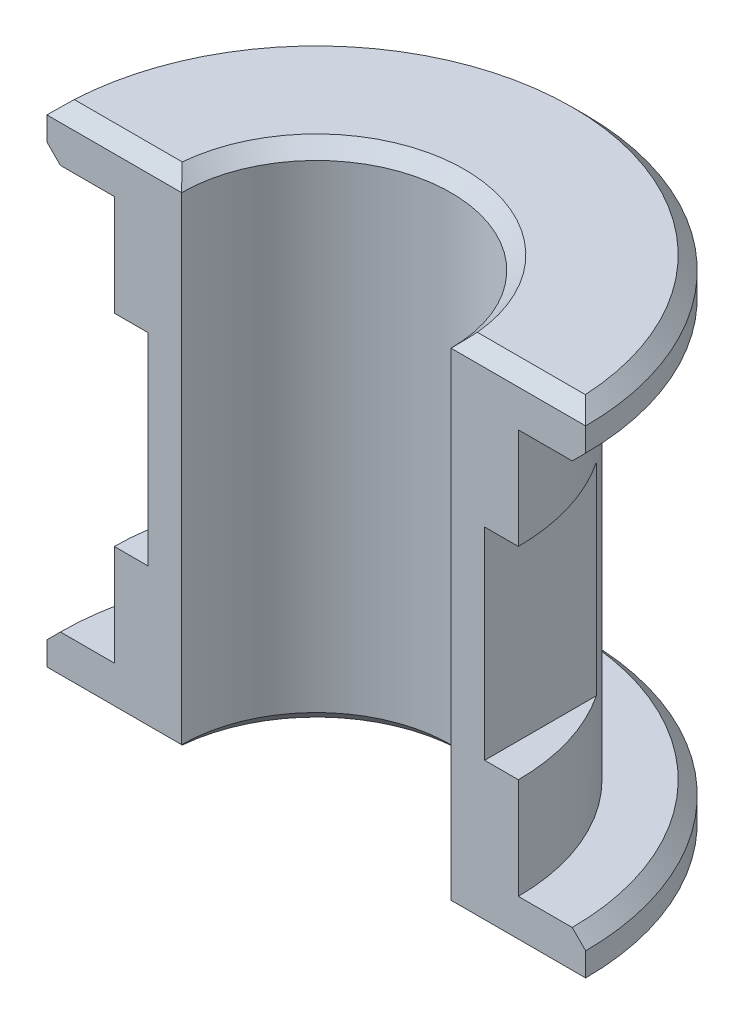
ISO-10303-21;
HEADER;
FILE_DESCRIPTION(('STEP AP214'),'2;1');
FILE_NAME('part.step','',(''),(''),'','','');
FILE_SCHEMA(('AUTOMOTIVE_DESIGN { 1 0 10303 214 1 1 1 1 }'));
ENDSEC;
DATA;
#1=APPLICATION_CONTEXT('core data for automotive mechanical design processes');
#2=APPLICATION_PROTOCOL_DEFINITION('international standard','automotive_design',2000,#1);
#3=PRODUCT_CONTEXT('',#1,'mechanical');
#4=PRODUCT('Part','Part','',(#3));
#5=PRODUCT_RELATED_PRODUCT_CATEGORY('part','',(#4));
#6=PRODUCT_DEFINITION_FORMATION('','',#4);
#7=PRODUCT_DEFINITION_CONTEXT('part definition',#1,'design');
#8=PRODUCT_DEFINITION('design','',#6,#7);
#9=PRODUCT_DEFINITION_SHAPE('','',#8);
#10=(LENGTH_UNIT() NAMED_UNIT(*) SI_UNIT(.MILLI.,.METRE.));
#11=(NAMED_UNIT(*) PLANE_ANGLE_UNIT() SI_UNIT($,.RADIAN.));
#12=(NAMED_UNIT(*) SI_UNIT($,.STERADIAN.) SOLID_ANGLE_UNIT());
#13=UNCERTAINTY_MEASURE_WITH_UNIT(LENGTH_MEASURE(1.E-05),#10,'distance_accuracy_value','');
#14=(GEOMETRIC_REPRESENTATION_CONTEXT(3) GLOBAL_UNCERTAINTY_ASSIGNED_CONTEXT((#13)) GLOBAL_UNIT_ASSIGNED_CONTEXT((#10,
#11,#12)) REPRESENTATION_CONTEXT('',''));
#15=CARTESIAN_POINT('',(0.,0.,0.));
#16=DIRECTION('',(0.,0.,1.));
#17=DIRECTION('',(1.,0.,0.));
#18=AXIS2_PLACEMENT_3D('',#15,#16,#17);
#19=CARTESIAN_POINT('',(0.,0.,0.));
#20=DIRECTION('',(0.,0.,-1.));
#21=DIRECTION('',(-1.,0.,0.));
#22=AXIS2_PLACEMENT_3D('',#19,#20,#21);
#23=PLANE('',#22);
#24=DIRECTION('',(0.,1.,0.));
#25=VECTOR('',#24,1.);
#26=CARTESIAN_POINT('',(-20.,37.5,1.39659253553725E-13));
#27=LINE('',#26,#25);
#28=CARTESIAN_POINT('',(-20.,-35.5,1.39659253553725E-13));
#29=VERTEX_POINT('',#28);
#30=CARTESIAN_POINT('',(-20.,35.5,1.39659253553725E-13));
#31=VERTEX_POINT('',#30);
#32=EDGE_CURVE('E465',#29,#31,#27,.T.);
#33=ORIENTED_EDGE('',*,*,#32,.T.);
#34=DIRECTION('',(-1.,0.,0.));
#35=VECTOR('',#34,1.);
#36=CARTESIAN_POINT('',(-40.,35.5,2.79318507107451E-13));
#37=LINE('',#36,#35);
#38=CARTESIAN_POINT('',(-40.,35.5,2.79318507107451E-13));
#39=VERTEX_POINT('',#38);
#40=EDGE_CURVE('E302',#31,#39,#37,.T.);
#41=ORIENTED_EDGE('',*,*,#40,.T.);
#42=DIRECTION('',(0.,1.,0.));
#43=VECTOR('',#42,1.);
#44=CARTESIAN_POINT('',(-40.,29.9999999905,2.79318507107451E-13));
#45=LINE('',#44,#43);
#46=CARTESIAN_POINT('',(-40.,31.9999999905,2.79318507107451E-13));
#47=VERTEX_POINT('',#46);
#48=EDGE_CURVE('E260',#47,#39,#45,.T.);
#49=ORIENTED_EDGE('',*,*,#48,.F.);
#50=DIRECTION('',(-0.707106781186546,0.707106781186549,0.));
#51=VECTOR('',#50,1.);
#52=CARTESIAN_POINT('',(0.,-8.00000000950015,0.));
#53=LINE('',#52,#51);
#54=CARTESIAN_POINT('',(-38.,29.9999999905,2.65352581752078E-13));
#55=VERTEX_POINT('',#54);
#56=EDGE_CURVE('E296',#47,#55,#53,.F.);
#57=ORIENTED_EDGE('',*,*,#56,.T.);
#58=DIRECTION('',(-1.,0.,0.));
#59=VECTOR('',#58,1.);
#60=CARTESIAN_POINT('',(-30.,29.9999999905,2.09488880330588E-13));
#61=LINE('',#60,#59);
#62=CARTESIAN_POINT('',(-30.,29.9999999905,2.09488880330588E-13));
#63=VERTEX_POINT('',#62);
#64=EDGE_CURVE('E257',#63,#55,#61,.T.);
#65=ORIENTED_EDGE('',*,*,#64,.F.);
#66=DIRECTION('',(0.,1.,0.));
#67=VECTOR('',#66,1.);
#68=CARTESIAN_POINT('',(-30.,-30.,2.09488880330588E-13));
#69=LINE('',#68,#67);
#70=CARTESIAN_POINT('',(-30.,15.,0.));
#71=VERTEX_POINT('',#70);
#72=EDGE_CURVE('E254',#71,#63,#69,.T.);
#73=ORIENTED_EDGE('',*,*,#72,.F.);
#74=DIRECTION('',(-1.,0.,0.));
#75=VECTOR('',#74,1.);
#76=CARTESIAN_POINT('',(-24.9999999986886,15.,0.));
#77=LINE('',#76,#75);
#78=CARTESIAN_POINT('',(-24.9999999986886,15.,0.));
#79=VERTEX_POINT('',#78);
#80=EDGE_CURVE('E194',#79,#71,#77,.T.);
#81=ORIENTED_EDGE('',*,*,#80,.F.);
#82=DIRECTION('',(0.,-1.,0.));
#83=VECTOR('',#82,1.);
#84=CARTESIAN_POINT('',(-24.9999999986886,15.,0.));
#85=LINE('',#84,#83);
#86=CARTESIAN_POINT('',(-24.9999999986886,-15.,0.));
#87=VERTEX_POINT('',#86);
#88=EDGE_CURVE('E191',#79,#87,#85,.T.);
#89=ORIENTED_EDGE('',*,*,#88,.T.);
#90=DIRECTION('',(-1.,0.,0.));
#91=VECTOR('',#90,1.);
#92=CARTESIAN_POINT('',(-24.9999999986886,-15.,0.));
#93=LINE('',#92,#91);
#94=CARTESIAN_POINT('',(-30.,-15.,2.09488880330588E-13));
#95=VERTEX_POINT('',#94);
#96=EDGE_CURVE('E201',#87,#95,#93,.T.);
#97=ORIENTED_EDGE('',*,*,#96,.T.);
#98=CARTESIAN_POINT('',(-30.,-30.,2.09488880330588E-13));
#99=VERTEX_POINT('',#98);
#100=EDGE_CURVE('E255',#99,#95,#69,.T.);
#101=ORIENTED_EDGE('',*,*,#100,.F.);
#102=DIRECTION('',(1.,0.,0.));
#103=VECTOR('',#102,1.);
#104=CARTESIAN_POINT('',(-40.,-30.,2.79318507107451E-13));
#105=LINE('',#104,#103);
#106=CARTESIAN_POINT('',(-38.,-30.,2.65352581752078E-13));
#107=VERTEX_POINT('',#106);
#108=EDGE_CURVE('E252',#107,#99,#105,.T.);
#109=ORIENTED_EDGE('',*,*,#108,.F.);
#110=DIRECTION('',(0.707106781186548,0.707106781186547,0.));
#111=VECTOR('',#110,1.);
#112=CARTESIAN_POINT('',(0.,8.00000000000001,0.));
#113=LINE('',#112,#111);
#114=CARTESIAN_POINT('',(-40.,-32.,2.79318507107451E-13));
#115=VERTEX_POINT('',#114);
#116=EDGE_CURVE('E298',#107,#115,#113,.F.);
#117=ORIENTED_EDGE('',*,*,#116,.T.);
#118=DIRECTION('',(0.,1.,0.));
#119=VECTOR('',#118,1.);
#120=CARTESIAN_POINT('',(-40.,-37.5,2.79318507107451E-13));
#121=LINE('',#120,#119);
#122=CARTESIAN_POINT('',(-40.,-35.5,2.79318507107451E-13));
#123=VERTEX_POINT('',#122);
#124=EDGE_CURVE('E249',#123,#115,#121,.T.);
#125=ORIENTED_EDGE('',*,*,#124,.F.);
#126=DIRECTION('',(1.,0.,0.));
#127=VECTOR('',#126,1.);
#128=CARTESIAN_POINT('',(-20.,-35.5,1.39659253553725E-13));
#129=LINE('',#128,#127);
#130=EDGE_CURVE('E300',#123,#29,#129,.T.);
#131=ORIENTED_EDGE('',*,*,#130,.T.);
#132=EDGE_LOOP('',(#33,#41,#49,#57,#65,#73,#81,#89,#97,#101,#109,#117,#125,#131));
#133=FACE_BOUND('',#132,.T.);
#134=ADVANCED_FACE('F37',(#133),#23,.F.);
#135=CARTESIAN_POINT('',(0.,37.5,0.));
#136=DIRECTION('',(0.,-1.,0.));
#137=DIRECTION('',(0.,0.,-1.));
#138=AXIS2_PLACEMENT_3D('',#135,#136,#137);
#139=CYLINDRICAL_SURFACE('',#138,30.);
#140=DIRECTION('',(0.,-1.,0.));
#141=VECTOR('',#140,1.);
#142=CARTESIAN_POINT('',(-24.9999999986886,15.,-16.583123953754));
#143=LINE('',#142,#141);
#144=CARTESIAN_POINT('',(-24.9999999986886,15.,-16.583123953754));
#145=VERTEX_POINT('',#144);
#146=CARTESIAN_POINT('',(-24.9999999986886,-15.,-16.583123953754));
#147=VERTEX_POINT('',#146);
#148=EDGE_CURVE('E188',#145,#147,#143,.T.);
#149=ORIENTED_EDGE('',*,*,#148,.F.);
#150=CARTESIAN_POINT('',(0.,15.,0.));
#151=DIRECTION('',(0.,-1.,0.));
#152=DIRECTION('',(0.,0.,-1.));
#153=AXIS2_PLACEMENT_3D('',#150,#151,#152);
#154=CIRCLE('',#153,30.);
#155=EDGE_CURVE('E195',#71,#145,#154,.T.);
#156=ORIENTED_EDGE('',*,*,#155,.F.);
#157=ORIENTED_EDGE('',*,*,#72,.T.);
#158=CARTESIAN_POINT('',(0.,29.9999999905,0.));
#159=DIRECTION('',(0.,-1.,0.));
#160=DIRECTION('',(0.,0.,-1.));
#161=AXIS2_PLACEMENT_3D('',#158,#159,#160);
#162=CIRCLE('',#161,30.);
#163=CARTESIAN_POINT('',(30.,29.9999999905,0.));
#164=VERTEX_POINT('',#163);
#165=EDGE_CURVE('E263',#63,#164,#162,.T.);
#166=ORIENTED_EDGE('',*,*,#165,.T.);
#167=DIRECTION('',(0.,1.,0.));
#168=VECTOR('',#167,1.);
#169=CARTESIAN_POINT('',(30.,-30.,0.));
#170=LINE('',#169,#168);
#171=CARTESIAN_POINT('',(30.0000000028004,15.,0.));
#172=VERTEX_POINT('',#171);
#173=EDGE_CURVE('E239',#172,#164,#170,.T.);
#174=ORIENTED_EDGE('',*,*,#173,.F.);
#175=CARTESIAN_POINT('',(2.8004363944171E-09,15.,0.));
#176=DIRECTION('',(0.,-1.,0.));
#177=DIRECTION('',(0.,0.,-1.));
#178=AXIS2_PLACEMENT_3D('',#175,#176,#177);
#179=CIRCLE('',#178,30.);
#180=CARTESIAN_POINT('',(25.,15.,-16.5831239559988));
#181=VERTEX_POINT('',#180);
#182=EDGE_CURVE('E220',#181,#172,#179,.T.);
#183=ORIENTED_EDGE('',*,*,#182,.F.);
#184=DIRECTION('',(0.,-1.,0.));
#185=VECTOR('',#184,1.);
#186=CARTESIAN_POINT('',(25.,15.,-16.5831239559988));
#187=LINE('',#186,#185);
#188=CARTESIAN_POINT('',(25.,-15.,-16.5831239559988));
#189=VERTEX_POINT('',#188);
#190=EDGE_CURVE('E229',#181,#189,#187,.T.);
#191=ORIENTED_EDGE('',*,*,#190,.T.);
#192=CARTESIAN_POINT('',(2.8004363944171E-09,-15.,0.));
#193=DIRECTION('',(0.,-1.,0.));
#194=DIRECTION('',(0.,0.,-1.));
#195=AXIS2_PLACEMENT_3D('',#192,#193,#194);
#196=CIRCLE('',#195,30.);
#197=CARTESIAN_POINT('',(30.0000000028004,-15.,0.));
#198=VERTEX_POINT('',#197);
#199=EDGE_CURVE('E217',#189,#198,#196,.T.);
#200=ORIENTED_EDGE('',*,*,#199,.T.);
#201=CARTESIAN_POINT('',(30.,-30.,0.));
#202=VERTEX_POINT('',#201);
#203=EDGE_CURVE('E240',#202,#198,#170,.T.);
#204=ORIENTED_EDGE('',*,*,#203,.F.);
#205=CARTESIAN_POINT('',(0.,-30.,0.));
#206=DIRECTION('',(0.,-1.,0.));
#207=DIRECTION('',(0.,0.,-1.));
#208=AXIS2_PLACEMENT_3D('',#205,#206,#207);
#209=CIRCLE('',#208,30.);
#210=EDGE_CURVE('E266',#99,#202,#209,.T.);
#211=ORIENTED_EDGE('',*,*,#210,.F.);
#212=ORIENTED_EDGE('',*,*,#100,.T.);
#213=CARTESIAN_POINT('',(0.,-15.,0.));
#214=DIRECTION('',(0.,-1.,0.));
#215=DIRECTION('',(0.,0.,-1.));
#216=AXIS2_PLACEMENT_3D('',#213,#214,#215);
#217=CIRCLE('',#216,30.);
#218=EDGE_CURVE('E206',#95,#147,#217,.T.);
#219=ORIENTED_EDGE('',*,*,#218,.T.);
#220=EDGE_LOOP('',(#149,#156,#157,#166,#174,#183,#191,#200,#204,#211,#212,#219));
#221=FACE_BOUND('',#220,.T.);
#222=ADVANCED_FACE('F204',(#221),#139,.T.);
#223=DIRECTION('',(0.,1.,0.));
#224=VECTOR('',#223,1.);
#225=CARTESIAN_POINT('',(40.,29.9999999905,0.));
#226=LINE('',#225,#224);
#227=CARTESIAN_POINT('',(40.,31.9999999905,0.));
#228=VERTEX_POINT('',#227);
#229=CARTESIAN_POINT('',(40.,35.5,0.));
#230=VERTEX_POINT('',#229);
#231=EDGE_CURVE('E246',#228,#230,#226,.T.);
#232=ORIENTED_EDGE('',*,*,#231,.T.);
#233=DIRECTION('',(-1.,0.,0.));
#234=VECTOR('',#233,1.);
#235=CARTESIAN_POINT('',(20.,35.5,-1.39659253553725E-13));
#236=LINE('',#235,#234);
#237=CARTESIAN_POINT('',(20.,35.5,-1.39659253553725E-13));
#238=VERTEX_POINT('',#237);
#239=EDGE_CURVE('E285',#230,#238,#236,.T.);
#240=ORIENTED_EDGE('',*,*,#239,.T.);
#241=DIRECTION('',(0.,1.,0.));
#242=VECTOR('',#241,1.);
#243=CARTESIAN_POINT('',(20.,37.5,-1.39659253553725E-13));
#244=LINE('',#243,#242);
#245=CARTESIAN_POINT('',(20.,-35.5,-1.39659253553725E-13));
#246=VERTEX_POINT('',#245);
#247=EDGE_CURVE('E358',#238,#246,#244,.F.);
#248=ORIENTED_EDGE('',*,*,#247,.T.);
#249=DIRECTION('',(1.,0.,0.));
#250=VECTOR('',#249,1.);
#251=CARTESIAN_POINT('',(40.,-35.5,-2.79318507107451E-13));
#252=LINE('',#251,#250);
#253=CARTESIAN_POINT('',(40.,-35.5,0.));
#254=VERTEX_POINT('',#253);
#255=EDGE_CURVE('E282',#246,#254,#252,.T.);
#256=ORIENTED_EDGE('',*,*,#255,.T.);
#257=DIRECTION('',(0.,1.,0.));
#258=VECTOR('',#257,1.);
#259=CARTESIAN_POINT('',(40.,-37.5,0.));
#260=LINE('',#259,#258);
#261=CARTESIAN_POINT('',(40.,-32.,-1.39659253553725E-13));
#262=VERTEX_POINT('',#261);
#263=EDGE_CURVE('E232',#254,#262,#260,.T.);
#264=ORIENTED_EDGE('',*,*,#263,.T.);
#265=DIRECTION('',(0.707106781186548,-0.707106781186547,0.));
#266=VECTOR('',#265,1.);
#267=CARTESIAN_POINT('',(0.,8.00000000000001,0.));
#268=LINE('',#267,#266);
#269=CARTESIAN_POINT('',(38.,-30.,0.));
#270=VERTEX_POINT('',#269);
#271=EDGE_CURVE('E280',#262,#270,#268,.F.);
#272=ORIENTED_EDGE('',*,*,#271,.T.);
#273=DIRECTION('',(-1.,0.,0.));
#274=VECTOR('',#273,1.);
#275=CARTESIAN_POINT('',(40.,-30.,0.));
#276=LINE('',#275,#274);
#277=EDGE_CURVE('E237',#270,#202,#276,.T.);
#278=ORIENTED_EDGE('',*,*,#277,.T.);
#279=ORIENTED_EDGE('',*,*,#203,.T.);
#280=DIRECTION('',(-1.,0.,0.));
#281=VECTOR('',#280,1.);
#282=CARTESIAN_POINT('',(30.0000000028004,-15.,0.));
#283=LINE('',#282,#281);
#284=CARTESIAN_POINT('',(25.,-15.,-1.74574066942157E-13));
#285=VERTEX_POINT('',#284);
#286=EDGE_CURVE('E208',#198,#285,#283,.T.);
#287=ORIENTED_EDGE('',*,*,#286,.T.);
#288=DIRECTION('',(0.,-1.,0.));
#289=VECTOR('',#288,1.);
#290=CARTESIAN_POINT('',(25.,15.,0.));
#291=LINE('',#290,#289);
#292=CARTESIAN_POINT('',(25.,15.,0.));
#293=VERTEX_POINT('',#292);
#294=EDGE_CURVE('E222',#293,#285,#291,.T.);
#295=ORIENTED_EDGE('',*,*,#294,.F.);
#296=DIRECTION('',(-1.,0.,0.));
#297=VECTOR('',#296,1.);
#298=CARTESIAN_POINT('',(30.0000000028004,15.,0.));
#299=LINE('',#298,#297);
#300=EDGE_CURVE('E213',#172,#293,#299,.T.);
#301=ORIENTED_EDGE('',*,*,#300,.F.);
#302=ORIENTED_EDGE('',*,*,#173,.T.);
#303=DIRECTION('',(1.,0.,0.));
#304=VECTOR('',#303,1.);
#305=CARTESIAN_POINT('',(30.,29.9999999905,0.));
#306=LINE('',#305,#304);
#307=CARTESIAN_POINT('',(38.,29.9999999905,-1.32676290876039E-13));
#308=VERTEX_POINT('',#307);
#309=EDGE_CURVE('E243',#164,#308,#306,.T.);
#310=ORIENTED_EDGE('',*,*,#309,.T.);
#311=DIRECTION('',(-0.707106781186546,-0.707106781186549,0.));
#312=VECTOR('',#311,1.);
#313=CARTESIAN_POINT('',(0.,-8.00000000950015,0.));
#314=LINE('',#313,#312);
#315=EDGE_CURVE('E278',#308,#228,#314,.F.);
#316=ORIENTED_EDGE('',*,*,#315,.T.);
#317=EDGE_LOOP('',(#232,#240,#248,#256,#264,#272,#278,#279,#287,#295,#301,#302,#310,#316));
#318=FACE_BOUND('',#317,.T.);
#319=ADVANCED_FACE('F408',(#318),#23,.F.);
#320=CARTESIAN_POINT('',(-40.,37.5,2.79318507107451E-13));
#321=DIRECTION('',(0.,1.,0.));
#322=DIRECTION('',(0.,0.,1.));
#323=AXIS2_PLACEMENT_3D('',#320,#321,#322);
#324=PLANE('',#323);
#325=CARTESIAN_POINT('',(0.,37.5,0.));
#326=DIRECTION('',(0.,1.,0.));
#327=DIRECTION('',(0.,0.,1.));
#328=AXIS2_PLACEMENT_3D('',#325,#326,#327);
#329=CIRCLE('',#328,21.9999999999999);
#330=CARTESIAN_POINT('',(-21.9089023002066,37.5,-1.99999999999981));
#331=VERTEX_POINT('',#330);
#332=CARTESIAN_POINT('',(21.9089023002066,37.5,-2.00000000000011));
#333=VERTEX_POINT('',#332);
#334=EDGE_CURVE('E273',#331,#333,#329,.F.);
#335=ORIENTED_EDGE('',*,*,#334,.T.);
#336=DIRECTION('',(1.,0.,0.));
#337=VECTOR('',#336,1.);
#338=CARTESIAN_POINT('',(40.,37.5,-2.00000000000024));
#339=LINE('',#338,#337);
#340=CARTESIAN_POINT('',(37.9473319220206,37.5,-2.00000000000023));
#341=VERTEX_POINT('',#340);
#342=EDGE_CURVE('E275',#333,#341,#339,.T.);
#343=ORIENTED_EDGE('',*,*,#342,.T.);
#344=CARTESIAN_POINT('',(0.,37.5,0.));
#345=DIRECTION('',(0.,1.,0.));
#346=DIRECTION('',(0.,0.,1.));
#347=AXIS2_PLACEMENT_3D('',#344,#345,#346);
#348=CIRCLE('',#347,38.);
#349=CARTESIAN_POINT('',(-37.9473319220206,37.5,-1.9999999999997));
#350=VERTEX_POINT('',#349);
#351=EDGE_CURVE('E271',#341,#350,#348,.T.);
#352=ORIENTED_EDGE('',*,*,#351,.T.);
#353=DIRECTION('',(1.,0.,0.));
#354=VECTOR('',#353,1.);
#355=CARTESIAN_POINT('',(-20.,37.5,-1.99999999999982));
#356=LINE('',#355,#354);
#357=EDGE_CURVE('E269',#350,#331,#356,.T.);
#358=ORIENTED_EDGE('',*,*,#357,.T.);
#359=EDGE_LOOP('',(#335,#343,#352,#358));
#360=FACE_BOUND('',#359,.T.);
#361=ADVANCED_FACE('F493',(#360),#324,.T.);
#362=CARTESIAN_POINT('',(0.,-37.5,0.));
#363=DIRECTION('',(0.,-1.,0.));
#364=DIRECTION('',(0.,0.,-1.));
#365=AXIS2_PLACEMENT_3D('',#362,#363,#364);
#366=PLANE('',#365);
#367=CARTESIAN_POINT('',(0.,-37.5,0.));
#368=DIRECTION('',(0.,-1.,0.));
#369=DIRECTION('',(0.,0.,-1.));
#370=AXIS2_PLACEMENT_3D('',#367,#368,#369);
#371=CIRCLE('',#370,38.);
#372=CARTESIAN_POINT('',(-37.9473319220206,-37.5,-1.9999999999997));
#373=VERTEX_POINT('',#372);
#374=CARTESIAN_POINT('',(37.9473319220206,-37.5,-2.00000000000023));
#375=VERTEX_POINT('',#374);
#376=EDGE_CURVE('E68',#373,#375,#371,.T.);
#377=ORIENTED_EDGE('',*,*,#376,.T.);
#378=DIRECTION('',(-1.,0.,0.));
#379=VECTOR('',#378,1.);
#380=CARTESIAN_POINT('',(20.,-37.5,-2.0000000000001));
#381=LINE('',#380,#379);
#382=CARTESIAN_POINT('',(21.9089023002066,-37.5,-2.00000000000011));
#383=VERTEX_POINT('',#382);
#384=EDGE_CURVE('E309',#375,#383,#381,.T.);
#385=ORIENTED_EDGE('',*,*,#384,.T.);
#386=CARTESIAN_POINT('',(0.,-37.5,0.));
#387=DIRECTION('',(0.,-1.,0.));
#388=DIRECTION('',(0.,0.,-1.));
#389=AXIS2_PLACEMENT_3D('',#386,#387,#388);
#390=CIRCLE('',#389,21.9999999999999);
#391=CARTESIAN_POINT('',(-21.9089023002066,-37.5,-1.99999999999981));
#392=VERTEX_POINT('',#391);
#393=EDGE_CURVE('E307',#383,#392,#390,.F.);
#394=ORIENTED_EDGE('',*,*,#393,.T.);
#395=DIRECTION('',(-1.,0.,0.));
#396=VECTOR('',#395,1.);
#397=CARTESIAN_POINT('',(-40.,-37.5,-1.99999999999968));
#398=LINE('',#397,#396);
#399=EDGE_CURVE('E304',#392,#373,#398,.T.);
#400=ORIENTED_EDGE('',*,*,#399,.T.);
#401=EDGE_LOOP('',(#377,#385,#394,#400));
#402=FACE_BOUND('',#401,.T.);
#403=ADVANCED_FACE('F497',(#402),#366,.T.);
#404=CARTESIAN_POINT('',(0.,37.5,0.));
#405=DIRECTION('',(0.,-1.,0.));
#406=DIRECTION('',(0.,0.,-1.));
#407=AXIS2_PLACEMENT_3D('',#404,#405,#406);
#408=CYLINDRICAL_SURFACE('',#407,40.);
#409=ORIENTED_EDGE('',*,*,#263,.F.);
#410=CARTESIAN_POINT('',(0.,-35.5,0.));
#411=DIRECTION('',(0.,-1.,0.));
#412=DIRECTION('',(0.,0.,-1.));
#413=AXIS2_PLACEMENT_3D('',#410,#411,#412);
#414=CIRCLE('',#413,40.);
#415=EDGE_CURVE('E314',#254,#123,#414,.F.);
#416=ORIENTED_EDGE('',*,*,#415,.T.);
#417=ORIENTED_EDGE('',*,*,#124,.T.);
#418=CARTESIAN_POINT('',(0.,-32.,0.));
#419=DIRECTION('',(0.,1.,0.));
#420=DIRECTION('',(0.,0.,1.));
#421=AXIS2_PLACEMENT_3D('',#418,#419,#420);
#422=CIRCLE('',#421,40.);
#423=EDGE_CURVE('E311',#115,#262,#422,.F.);
#424=ORIENTED_EDGE('',*,*,#423,.T.);
#425=EDGE_LOOP('',(#409,#416,#417,#424));
#426=FACE_BOUND('',#425,.T.);
#427=ADVANCED_FACE('F410',(#426),#408,.T.);
#428=CARTESIAN_POINT('',(-40.,-30.,2.79318507107451E-13));
#429=DIRECTION('',(0.,1.,0.));
#430=DIRECTION('',(0.,0.,1.));
#431=AXIS2_PLACEMENT_3D('',#428,#429,#430);
#432=PLANE('',#431);
#433=ORIENTED_EDGE('',*,*,#277,.F.);
#434=CARTESIAN_POINT('',(0.,-30.,0.));
#435=DIRECTION('',(0.,1.,0.));
#436=DIRECTION('',(0.,0.,1.));
#437=AXIS2_PLACEMENT_3D('',#434,#435,#436);
#438=CIRCLE('',#437,38.);
#439=EDGE_CURVE('E52',#270,#107,#438,.T.);
#440=ORIENTED_EDGE('',*,*,#439,.T.);
#441=ORIENTED_EDGE('',*,*,#108,.T.);
#442=ORIENTED_EDGE('',*,*,#210,.T.);
#443=EDGE_LOOP('',(#433,#440,#441,#442));
#444=FACE_BOUND('',#443,.T.);
#445=ADVANCED_FACE('F417',(#444),#432,.T.);
#446=CARTESIAN_POINT('',(-30.,29.9999999905,2.09488880330588E-13));
#447=DIRECTION('',(0.,-1.,0.));
#448=DIRECTION('',(0.,0.,-1.));
#449=AXIS2_PLACEMENT_3D('',#446,#447,#448);
#450=PLANE('',#449);
#451=ORIENTED_EDGE('',*,*,#64,.T.);
#452=CARTESIAN_POINT('',(0.,29.9999999905,0.));
#453=DIRECTION('',(0.,-1.,0.));
#454=DIRECTION('',(0.,0.,-1.));
#455=AXIS2_PLACEMENT_3D('',#452,#453,#454);
#456=CIRCLE('',#455,38.);
#457=EDGE_CURVE('E11',#55,#308,#456,.T.);
#458=ORIENTED_EDGE('',*,*,#457,.T.);
#459=ORIENTED_EDGE('',*,*,#309,.F.);
#460=ORIENTED_EDGE('',*,*,#165,.F.);
#461=EDGE_LOOP('',(#451,#458,#459,#460));
#462=FACE_BOUND('',#461,.T.);
#463=ADVANCED_FACE('F437',(#462),#450,.T.);
#464=CARTESIAN_POINT('',(0.,37.5,0.));
#465=DIRECTION('',(0.,-1.,0.));
#466=DIRECTION('',(0.,0.,-1.));
#467=AXIS2_PLACEMENT_3D('',#464,#465,#466);
#468=CYLINDRICAL_SURFACE('',#467,40.);
#469=ORIENTED_EDGE('',*,*,#48,.T.);
#470=CARTESIAN_POINT('',(0.,35.5,0.));
#471=DIRECTION('',(0.,1.,0.));
#472=DIRECTION('',(0.,0.,1.));
#473=AXIS2_PLACEMENT_3D('',#470,#471,#472);
#474=CIRCLE('',#473,40.);
#475=EDGE_CURVE('E294',#39,#230,#474,.F.);
#476=ORIENTED_EDGE('',*,*,#475,.T.);
#477=ORIENTED_EDGE('',*,*,#231,.F.);
#478=CARTESIAN_POINT('',(0.,31.9999999905,0.));
#479=DIRECTION('',(0.,-1.,0.));
#480=DIRECTION('',(0.,0.,-1.));
#481=AXIS2_PLACEMENT_3D('',#478,#479,#480);
#482=CIRCLE('',#481,40.);
#483=EDGE_CURVE('E292',#228,#47,#482,.F.);
#484=ORIENTED_EDGE('',*,*,#483,.T.);
#485=EDGE_LOOP('',(#469,#476,#477,#484));
#486=FACE_BOUND('',#485,.T.);
#487=ADVANCED_FACE('F444',(#486),#468,.T.);
#488=CARTESIAN_POINT('',(25.,15.,0.));
#489=DIRECTION('',(-1.,0.,0.));
#490=DIRECTION('',(0.,0.,1.));
#491=AXIS2_PLACEMENT_3D('',#488,#489,#490);
#492=PLANE('',#491);
#493=DIRECTION('',(0.,0.,-1.));
#494=VECTOR('',#493,1.);
#495=CARTESIAN_POINT('',(25.,-15.,0.));
#496=LINE('',#495,#494);
#497=EDGE_CURVE('E225',#285,#189,#496,.T.);
#498=ORIENTED_EDGE('',*,*,#497,.T.);
#499=ORIENTED_EDGE('',*,*,#190,.F.);
#500=DIRECTION('',(0.,0.,-1.));
#501=VECTOR('',#500,1.);
#502=CARTESIAN_POINT('',(25.,15.,0.));
#503=LINE('',#502,#501);
#504=EDGE_CURVE('E216',#293,#181,#503,.T.);
#505=ORIENTED_EDGE('',*,*,#504,.F.);
#506=ORIENTED_EDGE('',*,*,#294,.T.);
#507=EDGE_LOOP('',(#498,#499,#505,#506));
#508=FACE_BOUND('',#507,.T.);
#509=ADVANCED_FACE('F428',(#508),#492,.F.);
#510=CARTESIAN_POINT('',(2.8004363944171E-09,15.,0.));
#511=DIRECTION('',(0.,-1.,0.));
#512=DIRECTION('',(0.,0.,-1.));
#513=AXIS2_PLACEMENT_3D('',#510,#511,#512);
#514=PLANE('',#513);
#515=ORIENTED_EDGE('',*,*,#300,.T.);
#516=ORIENTED_EDGE('',*,*,#504,.T.);
#517=ORIENTED_EDGE('',*,*,#182,.T.);
#518=EDGE_LOOP('',(#515,#516,#517));
#519=FACE_BOUND('',#518,.T.);
#520=ADVANCED_FACE('F431',(#519),#514,.T.);
#521=CARTESIAN_POINT('',(2.8004363944171E-09,-15.,0.));
#522=DIRECTION('',(0.,-1.,0.));
#523=DIRECTION('',(0.,0.,-1.));
#524=AXIS2_PLACEMENT_3D('',#521,#522,#523);
#525=PLANE('',#524);
#526=ORIENTED_EDGE('',*,*,#286,.F.);
#527=ORIENTED_EDGE('',*,*,#199,.F.);
#528=ORIENTED_EDGE('',*,*,#497,.F.);
#529=EDGE_LOOP('',(#526,#527,#528));
#530=FACE_BOUND('',#529,.T.);
#531=ADVANCED_FACE('F426',(#530),#525,.F.);
#532=CARTESIAN_POINT('',(-24.9999999986886,15.,-16.583123953754));
#533=DIRECTION('',(1.,0.,0.));
#534=DIRECTION('',(0.,0.,-1.));
#535=AXIS2_PLACEMENT_3D('',#532,#533,#534);
#536=PLANE('',#535);
#537=DIRECTION('',(0.,0.,1.));
#538=VECTOR('',#537,1.);
#539=CARTESIAN_POINT('',(-24.9999999986886,-15.,-16.583123953754));
#540=LINE('',#539,#538);
#541=EDGE_CURVE('E470',#147,#87,#540,.T.);
#542=ORIENTED_EDGE('',*,*,#541,.T.);
#543=ORIENTED_EDGE('',*,*,#88,.F.);
#544=DIRECTION('',(0.,0.,1.));
#545=VECTOR('',#544,1.);
#546=CARTESIAN_POINT('',(-24.9999999986886,15.,-16.583123953754));
#547=LINE('',#546,#545);
#548=EDGE_CURVE('E184',#145,#79,#547,.T.);
#549=ORIENTED_EDGE('',*,*,#548,.F.);
#550=ORIENTED_EDGE('',*,*,#148,.T.);
#551=EDGE_LOOP('',(#542,#543,#549,#550));
#552=FACE_BOUND('',#551,.T.);
#553=ADVANCED_FACE('F186',(#552),#536,.F.);
#554=CARTESIAN_POINT('',(0.,15.,0.));
#555=DIRECTION('',(0.,-1.,0.));
#556=DIRECTION('',(0.,0.,-1.));
#557=AXIS2_PLACEMENT_3D('',#554,#555,#556);
#558=PLANE('',#557);
#559=ORIENTED_EDGE('',*,*,#155,.T.);
#560=ORIENTED_EDGE('',*,*,#548,.T.);
#561=ORIENTED_EDGE('',*,*,#80,.T.);
#562=EDGE_LOOP('',(#559,#560,#561));
#563=FACE_BOUND('',#562,.T.);
#564=ADVANCED_FACE('F198',(#563),#558,.T.);
#565=CARTESIAN_POINT('',(0.,-15.,0.));
#566=DIRECTION('',(0.,-1.,0.));
#567=DIRECTION('',(0.,0.,-1.));
#568=AXIS2_PLACEMENT_3D('',#565,#566,#567);
#569=PLANE('',#568);
#570=ORIENTED_EDGE('',*,*,#218,.F.);
#571=ORIENTED_EDGE('',*,*,#96,.F.);
#572=ORIENTED_EDGE('',*,*,#541,.F.);
#573=EDGE_LOOP('',(#570,#571,#572));
#574=FACE_BOUND('',#573,.T.);
#575=ADVANCED_FACE('F474',(#574),#569,.F.);
#576=CARTESIAN_POINT('',(0.,37.5,0.));
#577=DIRECTION('',(0.,1.,0.));
#578=DIRECTION('',(0.,0.,1.));
#579=AXIS2_PLACEMENT_3D('',#576,#577,#578);
#580=CYLINDRICAL_SURFACE('',#579,20.);
#581=ORIENTED_EDGE('',*,*,#247,.F.);
#582=CARTESIAN_POINT('',(0.,35.5,0.));
#583=DIRECTION('',(0.,1.,0.));
#584=DIRECTION('',(0.,0.,1.));
#585=AXIS2_PLACEMENT_3D('',#582,#583,#584);
#586=CIRCLE('',#585,20.);
#587=EDGE_CURVE('E290',#238,#31,#586,.T.);
#588=ORIENTED_EDGE('',*,*,#587,.T.);
#589=ORIENTED_EDGE('',*,*,#32,.F.);
#590=CARTESIAN_POINT('',(0.,-35.5,0.));
#591=DIRECTION('',(0.,-1.,0.));
#592=DIRECTION('',(0.,0.,-1.));
#593=AXIS2_PLACEMENT_3D('',#590,#591,#592);
#594=CIRCLE('',#593,20.);
#595=EDGE_CURVE('E288',#29,#246,#594,.T.);
#596=ORIENTED_EDGE('',*,*,#595,.T.);
#597=EDGE_LOOP('',(#581,#588,#589,#596));
#598=FACE_BOUND('',#597,.T.);
#599=ADVANCED_FACE('F463',(#598),#580,.F.);
#600=CARTESIAN_POINT('',(-40.,37.5,-1.99999999999968));
#601=DIRECTION('',(0.,0.707106781186543,0.707106781186552));
#602=DIRECTION('',(-1.,0.,0.));
#603=AXIS2_PLACEMENT_3D('',#600,#601,#602);
#604=PLANE('',#603);
#605=CARTESIAN_POINT('',(-37.9473319220206,37.5,-1.99999999999969));
#606=CARTESIAN_POINT('',(-38.1213838914765,37.334879438153,-1.83487943815273));
#607=CARTESIAN_POINT('',(-38.2946663504846,37.1693536002739,-1.66935360027362));
#608=CARTESIAN_POINT('',(-38.6397176258453,36.8375249133835,-1.33752491338319));
#609=CARTESIAN_POINT('',(-38.8114865012254,36.6712220950638,-1.17122209506349));
#610=CARTESIAN_POINT('',(-39.1535491883956,36.337860466912,-0.837860466911741));
#611=CARTESIAN_POINT('',(-39.3238430038958,36.1708016589831,-0.670801658982783));
#612=CARTESIAN_POINT('',(-39.662993442844,35.8359462668835,-0.33594626688324));
#613=CARTESIAN_POINT('',(-39.8318500097308,35.668149654068,-0.168149654067656));
#614=CARTESIAN_POINT('',(-40.,35.5,2.69915841365699E-13));
#615=B_SPLINE_CURVE_WITH_KNOTS('',3,(#605,#606,#607,#608,#609,#610,#611,#612,#613,#614),
.UNSPECIFIED.,.F.,.F.,(4,2,2,2,4),(0.,0.873733139975881,1.74743205346494,2.62112876876285,
3.4948597099195),.UNSPECIFIED.);
#616=EDGE_CURVE('E359',#39,#350,#615,.F.);
#617=ORIENTED_EDGE('',*,*,#616,.F.);
#618=ORIENTED_EDGE('',*,*,#40,.F.);
#619=CARTESIAN_POINT('',(-20.,35.5,1.39659253553725E-13));
#620=CARTESIAN_POINT('',(-20.1641968055961,35.6641990096948,-0.164199009694649));
#621=CARTESIAN_POINT('',(-20.3270474979012,35.8290695455331,-0.329069545532975));
#622=CARTESIAN_POINT('',(-20.6501418526993,36.1600560425496,-0.660056042549453));
#623=CARTESIAN_POINT('',(-20.8103858038272,36.3261718628253,-0.826171862825078));
#624=CARTESIAN_POINT('',(-21.1283863347134,36.6595857432796,-1.15958574327946));
#625=CARTESIAN_POINT('',(-21.2861429473745,36.8268837877773,-1.32688378777713));
#626=CARTESIAN_POINT('',(-21.5992833079527,37.1626135256066,-1.66261352560641));
#627=CARTESIAN_POINT('',(-21.7546667893525,37.3310453432518,-1.83104534325161));
#628=CARTESIAN_POINT('',(-21.9089023002066,37.5,-1.99999999999981));
#629=B_SPLINE_CURVE_WITH_KNOTS('',3,(#619,#620,#621,#622,#623,#624,#625,#626,#627,#628),
.UNSPECIFIED.,.F.,.F.,(4,2,2,2,4),(0.,0.853191961608534,1.7062888003714,2.55937434477517,
3.41255500170578),.UNSPECIFIED.);
#630=EDGE_CURVE('E351',#331,#31,#629,.F.);
#631=ORIENTED_EDGE('',*,*,#630,.F.);
#632=ORIENTED_EDGE('',*,*,#357,.F.);
#633=EDGE_LOOP('',(#617,#618,#631,#632));
#634=FACE_BOUND('',#633,.T.);
#635=ADVANCED_FACE('F345',(#634),#604,.T.);
#636=CARTESIAN_POINT('',(0.,35.5,0.));
#637=DIRECTION('',(0.,1.,0.));
#638=DIRECTION('',(0.,0.,1.));
#639=AXIS2_PLACEMENT_3D('',#636,#637,#638);
#640=CONICAL_SURFACE('',#639,20.,0.785398163397441);
#641=ORIENTED_EDGE('',*,*,#630,.T.);
#642=ORIENTED_EDGE('',*,*,#587,.F.);
#643=CARTESIAN_POINT('',(20.,35.5,-1.39659253553725E-13));
#644=CARTESIAN_POINT('',(20.1641968055961,35.6641990096948,-0.164199009694931));
#645=CARTESIAN_POINT('',(20.3270474979012,35.8290695455331,-0.329069545533259));
#646=CARTESIAN_POINT('',(20.6501418526993,36.1600560425496,-0.660056042549742));
#647=CARTESIAN_POINT('',(20.8103858038272,36.3261718628253,-0.826171862825369));
#648=CARTESIAN_POINT('',(21.1283863347133,36.6595857432796,-1.15958574327975));
#649=CARTESIAN_POINT('',(21.2861429473745,36.8268837877773,-1.32688378777742));
#650=CARTESIAN_POINT('',(21.5992833079527,37.1626135256066,-1.66261352560671));
#651=CARTESIAN_POINT('',(21.7546667893525,37.3310453432518,-1.83104534325191));
#652=CARTESIAN_POINT('',(21.9089023002066,37.5,-2.00000000000011));
#653=B_SPLINE_CURVE_WITH_KNOTS('',3,(#643,#644,#645,#646,#647,#648,#649,#650,#651,#652),
.UNSPECIFIED.,.F.,.F.,(4,2,2,2,4),(0.,0.853191961608534,1.7062888003714,2.55937434477516,
3.41255500170578),.UNSPECIFIED.);
#654=EDGE_CURVE('E325',#333,#238,#653,.F.);
#655=ORIENTED_EDGE('',*,*,#654,.F.);
#656=ORIENTED_EDGE('',*,*,#334,.F.);
#657=EDGE_LOOP('',(#641,#642,#655,#656));
#658=FACE_BOUND('',#657,.T.);
#659=ADVANCED_FACE('F340',(#658),#640,.F.);
#660=CARTESIAN_POINT('',(0.,35.5,0.));
#661=DIRECTION('',(0.,-1.,0.));
#662=DIRECTION('',(0.,0.,-1.));
#663=AXIS2_PLACEMENT_3D('',#660,#661,#662);
#664=CONICAL_SURFACE('',#663,40.,0.785398163397441);
#665=ORIENTED_EDGE('',*,*,#616,.T.);
#666=ORIENTED_EDGE('',*,*,#351,.F.);
#667=CARTESIAN_POINT('',(37.9473319220206,37.5,-2.00000000000023));
#668=CARTESIAN_POINT('',(38.1213838914765,37.334879438153,-1.83487943815325));
#669=CARTESIAN_POINT('',(38.2946663504846,37.1693536002739,-1.66935360027414));
#670=CARTESIAN_POINT('',(38.6397176258453,36.8375249133835,-1.33752491338371));
#671=CARTESIAN_POINT('',(38.8114865012254,36.6712220950638,-1.17122209506402));
#672=CARTESIAN_POINT('',(39.1535491883956,36.337860466912,-0.837860466912263));
#673=CARTESIAN_POINT('',(39.3238430038958,36.1708016589831,-0.670801658983303));
#674=CARTESIAN_POINT('',(39.6629934428441,35.8359462668835,-0.335946266883756));
#675=CARTESIAN_POINT('',(39.8318500097309,35.6681496540679,-0.168149654068171));
#676=CARTESIAN_POINT('',(40.0000000000001,35.5,-2.44125060000852E-13));
#677=B_SPLINE_CURVE_WITH_KNOTS('',3,(#667,#668,#669,#670,#671,#672,#673,#674,#675,#676),
.UNSPECIFIED.,.F.,.F.,(4,2,2,2,4),(0.,0.873733139975906,1.74743205346498,2.62112876876291,
3.49485970991957),.UNSPECIFIED.);
#678=EDGE_CURVE('E317',#230,#341,#677,.F.);
#679=ORIENTED_EDGE('',*,*,#678,.F.);
#680=ORIENTED_EDGE('',*,*,#475,.F.);
#681=EDGE_LOOP('',(#665,#666,#679,#680));
#682=FACE_BOUND('',#681,.T.);
#683=ADVANCED_FACE('F332',(#682),#664,.T.);
#684=CARTESIAN_POINT('',(-40.,37.5,-1.99999999999968));
#685=DIRECTION('',(0.,0.707106781186543,0.707106781186552));
#686=DIRECTION('',(-1.,0.,0.));
#687=AXIS2_PLACEMENT_3D('',#684,#685,#686);
#688=PLANE('',#687);
#689=ORIENTED_EDGE('',*,*,#654,.T.);
#690=ORIENTED_EDGE('',*,*,#239,.F.);
#691=ORIENTED_EDGE('',*,*,#678,.T.);
#692=ORIENTED_EDGE('',*,*,#342,.F.);
#693=EDGE_LOOP('',(#689,#690,#691,#692));
#694=FACE_BOUND('',#693,.T.);
#695=ADVANCED_FACE('F335',(#694),#688,.T.);
#696=CARTESIAN_POINT('',(0.,-37.5,-1.99999999999996));
#697=DIRECTION('',(0.,-0.707106781186545,0.70710678118655));
#698=DIRECTION('',(1.,0.,0.));
#699=AXIS2_PLACEMENT_3D('',#696,#697,#698);
#700=PLANE('',#699);
#701=CARTESIAN_POINT('',(-21.9089023002066,-37.5,-1.99999999999981));
#702=CARTESIAN_POINT('',(-21.7546667893525,-37.3310453432518,-1.8310453432516));
#703=CARTESIAN_POINT('',(-21.5992833079527,-37.1626135256066,-1.66261352560641));
#704=CARTESIAN_POINT('',(-21.2861429473745,-36.8268837877773,-1.32688378777713));
#705=CARTESIAN_POINT('',(-21.1283863347134,-36.6595857432796,-1.15958574327946));
#706=CARTESIAN_POINT('',(-20.8103858038272,-36.3261718628253,-0.826171862825081));
#707=CARTESIAN_POINT('',(-20.6501418526993,-36.1600560425496,-0.660056042549455));
#708=CARTESIAN_POINT('',(-20.3270474979012,-35.8290695455331,-0.329069545532978));
#709=CARTESIAN_POINT('',(-20.1641968055961,-35.6641990096948,-0.164199009694652));
#710=CARTESIAN_POINT('',(-20.,-35.5,1.35635656002057E-13));
#711=B_SPLINE_CURVE_WITH_KNOTS('',3,(#701,#702,#703,#704,#705,#706,#707,#708,#709,#710),
.UNSPECIFIED.,.F.,.F.,(4,2,2,2,4),(0.,0.853180656930613,1.70626620133438,2.55936304009724,
3.41255500170576),.UNSPECIFIED.);
#712=EDGE_CURVE('E391',#29,#392,#711,.F.);
#713=ORIENTED_EDGE('',*,*,#712,.F.);
#714=ORIENTED_EDGE('',*,*,#130,.F.);
#715=CARTESIAN_POINT('',(-40.,-35.5,2.79318507107451E-13));
#716=CARTESIAN_POINT('',(-39.8318500097308,-35.668149654068,-0.168149654067655));
#717=CARTESIAN_POINT('',(-39.662993442844,-35.8359462668835,-0.335946266883242));
#718=CARTESIAN_POINT('',(-39.3238430038958,-36.1708016589831,-0.670801658982788));
#719=CARTESIAN_POINT('',(-39.1535491883956,-36.337860466912,-0.837860466911746));
#720=CARTESIAN_POINT('',(-38.8114865012254,-36.6712220950638,-1.1712220950635));
#721=CARTESIAN_POINT('',(-38.6397176258453,-36.8375249133835,-1.33752491338319));
#722=CARTESIAN_POINT('',(-38.2946663504846,-37.1693536002739,-1.66935360027362));
#723=CARTESIAN_POINT('',(-38.1213838914765,-37.334879438153,-1.83487943815273));
#724=CARTESIAN_POINT('',(-37.9473319220206,-37.5,-1.9999999999997));
#725=B_SPLINE_CURVE_WITH_KNOTS('',3,(#715,#716,#717,#718,#719,#720,#721,#722,#723,#724),
.UNSPECIFIED.,.F.,.F.,(4,2,2,2,4),(0.,0.873730941156642,1.74742765645455,2.62112656994361,
3.49485970991948),.UNSPECIFIED.);
#726=EDGE_CURVE('E41',#373,#123,#725,.F.);
#727=ORIENTED_EDGE('',*,*,#726,.F.);
#728=ORIENTED_EDGE('',*,*,#399,.F.);
#729=EDGE_LOOP('',(#713,#714,#727,#728));
#730=FACE_BOUND('',#729,.T.);
#731=ADVANCED_FACE('F338',(#730),#700,.T.);
#732=CARTESIAN_POINT('',(0.,-37.5,0.));
#733=DIRECTION('',(0.,1.,0.));
#734=DIRECTION('',(0.,0.,1.));
#735=AXIS2_PLACEMENT_3D('',#732,#733,#734);
#736=CONICAL_SURFACE('',#735,38.,0.785398163397445);
#737=ORIENTED_EDGE('',*,*,#726,.T.);
#738=ORIENTED_EDGE('',*,*,#415,.F.);
#739=CARTESIAN_POINT('',(40.,-35.5,-1.39659253553725E-13));
#740=CARTESIAN_POINT('',(39.8318500097308,-35.6681496540679,-0.168149654068138));
#741=CARTESIAN_POINT('',(39.6629934428441,-35.8359462668835,-0.335946266883751));
#742=CARTESIAN_POINT('',(39.3238430038958,-36.1708016589831,-0.670801658983316));
#743=CARTESIAN_POINT('',(39.1535491883956,-36.337860466912,-0.837860466912267));
#744=CARTESIAN_POINT('',(38.8114865012254,-36.6712220950638,-1.17122209506401));
#745=CARTESIAN_POINT('',(38.6397176258453,-36.8375249133835,-1.33752491338371));
#746=CARTESIAN_POINT('',(38.2946663504846,-37.1693536002739,-1.66935360027415));
#747=CARTESIAN_POINT('',(38.1213838914765,-37.334879438153,-1.83487943815326));
#748=CARTESIAN_POINT('',(37.9473319220206,-37.5,-2.00000000000023));
#749=B_SPLINE_CURVE_WITH_KNOTS('',3,(#739,#740,#741,#742,#743,#744,#745,#746,#747,#748),
.UNSPECIFIED.,.F.,.F.,(4,2,2,2,4),(0.,0.873730941156663,1.74742765645459,2.62112656994367,
3.49485970991956),.UNSPECIFIED.);
#750=EDGE_CURVE('E370',#375,#254,#749,.F.);
#751=ORIENTED_EDGE('',*,*,#750,.F.);
#752=ORIENTED_EDGE('',*,*,#376,.F.);
#753=EDGE_LOOP('',(#737,#738,#751,#752));
#754=FACE_BOUND('',#753,.T.);
#755=ADVANCED_FACE('F381',(#754),#736,.T.);
#756=CARTESIAN_POINT('',(0.,-37.5,0.));
#757=DIRECTION('',(0.,-1.,0.));
#758=DIRECTION('',(0.,0.,-1.));
#759=AXIS2_PLACEMENT_3D('',#756,#757,#758);
#760=CONICAL_SURFACE('',#759,21.9999999999999,0.785398163397445);
#761=ORIENTED_EDGE('',*,*,#712,.T.);
#762=ORIENTED_EDGE('',*,*,#393,.F.);
#763=CARTESIAN_POINT('',(21.9089023002066,-37.5,-2.00000000000011));
#764=CARTESIAN_POINT('',(21.7546667893525,-37.3310453432518,-1.83104534325191));
#765=CARTESIAN_POINT('',(21.5992833079527,-37.1626135256066,-1.66261352560671));
#766=CARTESIAN_POINT('',(21.2861429473745,-36.8268837877773,-1.32688378777743));
#767=CARTESIAN_POINT('',(21.1283863347133,-36.6595857432796,-1.15958574327975));
#768=CARTESIAN_POINT('',(20.8103858038272,-36.3261718628253,-0.826171862825371));
#769=CARTESIAN_POINT('',(20.6501418526993,-36.1600560425496,-0.660056042549742));
#770=CARTESIAN_POINT('',(20.3270474979012,-35.8290695455331,-0.32906954553326));
#771=CARTESIAN_POINT('',(20.1641968055961,-35.6641990096948,-0.164199009694933));
#772=CARTESIAN_POINT('',(20.,-35.5,-1.43304618219799E-13));
#773=B_SPLINE_CURVE_WITH_KNOTS('',3,(#763,#764,#765,#766,#767,#768,#769,#770,#771,#772),
.UNSPECIFIED.,.F.,.F.,(4,2,2,2,4),(0.,0.853180656930613,1.70626620133438,2.55936304009724,
3.41255500170577),.UNSPECIFIED.);
#774=EDGE_CURVE('E60',#246,#383,#773,.F.);
#775=ORIENTED_EDGE('',*,*,#774,.F.);
#776=ORIENTED_EDGE('',*,*,#595,.F.);
#777=EDGE_LOOP('',(#761,#762,#775,#776));
#778=FACE_BOUND('',#777,.T.);
#779=ADVANCED_FACE('F375',(#778),#760,.F.);
#780=CARTESIAN_POINT('',(0.,-37.5,-1.99999999999996));
#781=DIRECTION('',(0.,-0.707106781186545,0.70710678118655));
#782=DIRECTION('',(1.,0.,0.));
#783=AXIS2_PLACEMENT_3D('',#780,#781,#782);
#784=PLANE('',#783);
#785=ORIENTED_EDGE('',*,*,#750,.T.);
#786=ORIENTED_EDGE('',*,*,#255,.F.);
#787=ORIENTED_EDGE('',*,*,#774,.T.);
#788=ORIENTED_EDGE('',*,*,#384,.F.);
#789=EDGE_LOOP('',(#785,#786,#787,#788));
#790=FACE_BOUND('',#789,.T.);
#791=ADVANCED_FACE('F377',(#790),#784,.T.);
#792=CARTESIAN_POINT('',(0.,-32.,0.));
#793=DIRECTION('',(0.,-1.,0.));
#794=DIRECTION('',(0.,0.,-1.));
#795=AXIS2_PLACEMENT_3D('',#792,#793,#794);
#796=CONICAL_SURFACE('',#795,40.,0.785398163397448);
#797=ORIENTED_EDGE('',*,*,#116,.F.);
#798=ORIENTED_EDGE('',*,*,#439,.F.);
#799=ORIENTED_EDGE('',*,*,#271,.F.);
#800=ORIENTED_EDGE('',*,*,#423,.F.);
#801=EDGE_LOOP('',(#797,#798,#799,#800));
#802=FACE_BOUND('',#801,.T.);
#803=ADVANCED_FACE('F380',(#802),#796,.T.);
#804=CARTESIAN_POINT('',(0.,29.9999999905,0.));
#805=DIRECTION('',(0.,1.,0.));
#806=DIRECTION('',(0.,0.,1.));
#807=AXIS2_PLACEMENT_3D('',#804,#805,#806);
#808=CONICAL_SURFACE('',#807,38.,0.785398163397447);
#809=ORIENTED_EDGE('',*,*,#56,.F.);
#810=ORIENTED_EDGE('',*,*,#483,.F.);
#811=ORIENTED_EDGE('',*,*,#315,.F.);
#812=ORIENTED_EDGE('',*,*,#457,.F.);
#813=EDGE_LOOP('',(#809,#810,#811,#812));
#814=FACE_BOUND('',#813,.T.);
#815=ADVANCED_FACE('F39',(#814),#808,.T.);
#816=CLOSED_SHELL('',(#134,#222,#319,#361,#403,#427,#445,#463,#487,#509,#520,#531,#553,#564,
#575,#599,#635,#659,#683,#695,#731,#755,#779,#791,#803,#815));
#817=MANIFOLD_SOLID_BREP('B2',#816);
#818=ADVANCED_BREP_SHAPE_REPRESENTATION('',(#18,#817),#14);
#819=SHAPE_DEFINITION_REPRESENTATION(#9,#818);
ENDSEC;
END-ISO-10303-21;
